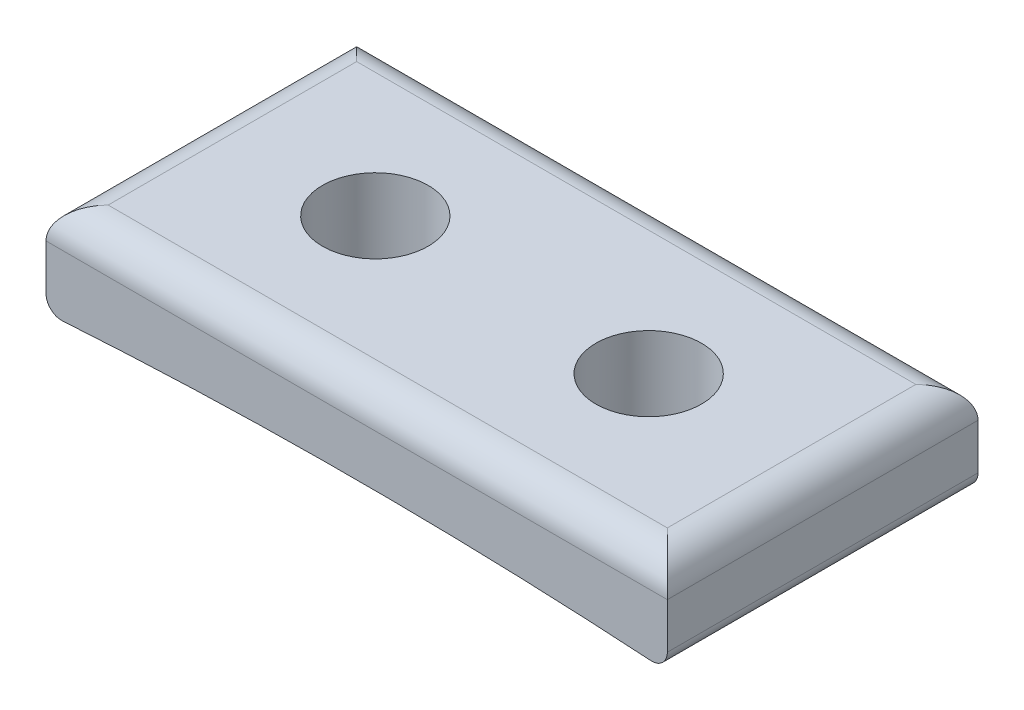
ISO-10303-21;
HEADER;
FILE_DESCRIPTION(('STEP AP214'),'2;1');
FILE_NAME('part.step','',(''),(''),'','','');
FILE_SCHEMA(('AUTOMOTIVE_DESIGN { 1 0 10303 214 1 1 1 1 }'));
ENDSEC;
DATA;
#1=APPLICATION_CONTEXT('core data for automotive mechanical design processes');
#2=APPLICATION_PROTOCOL_DEFINITION('international standard','automotive_design',2000,#1);
#3=PRODUCT_CONTEXT('',#1,'mechanical');
#4=PRODUCT('Part','Part','',(#3));
#5=PRODUCT_RELATED_PRODUCT_CATEGORY('part','',(#4));
#6=PRODUCT_DEFINITION_FORMATION('','',#4);
#7=PRODUCT_DEFINITION_CONTEXT('part definition',#1,'design');
#8=PRODUCT_DEFINITION('design','',#6,#7);
#9=PRODUCT_DEFINITION_SHAPE('','',#8);
#10=(LENGTH_UNIT() NAMED_UNIT(*) SI_UNIT(.MILLI.,.METRE.));
#11=(NAMED_UNIT(*) PLANE_ANGLE_UNIT() SI_UNIT($,.RADIAN.));
#12=(NAMED_UNIT(*) SI_UNIT($,.STERADIAN.) SOLID_ANGLE_UNIT());
#13=UNCERTAINTY_MEASURE_WITH_UNIT(LENGTH_MEASURE(1.E-05),#10,'distance_accuracy_value','');
#14=(GEOMETRIC_REPRESENTATION_CONTEXT(3) GLOBAL_UNCERTAINTY_ASSIGNED_CONTEXT((#13)) GLOBAL_UNIT_ASSIGNED_CONTEXT((#10,
#11,#12)) REPRESENTATION_CONTEXT('',''));
#15=CARTESIAN_POINT('',(0.,0.,0.));
#16=DIRECTION('',(0.,0.,1.));
#17=DIRECTION('',(1.,0.,0.));
#18=AXIS2_PLACEMENT_3D('',#15,#16,#17);
#19=CARTESIAN_POINT('',(-6.23076923076924,3.,-3.));
#20=DIRECTION('',(0.,0.,1.));
#21=DIRECTION('',(1.,0.,0.));
#22=AXIS2_PLACEMENT_3D('',#19,#20,#21);
#23=PLANE('',#22);
#24=CARTESIAN_POINT('',(3.76923076923076,-146.918654167508,-3.));
#25=DIRECTION('',(0.,0.,1.));
#26=DIRECTION('',(1.,0.,0.));
#27=AXIS2_PLACEMENT_3D('',#24,#25,#26);
#28=CIRCLE('',#27,147.258585292647);
#29=CARTESIAN_POINT('',(13.2370837370255,0.0352525603229403,-3.00000000000001));
#30=VERTEX_POINT('',#29);
#31=CARTESIAN_POINT('',(-5.69862219856403,0.0352525603229403,-3.));
#32=VERTEX_POINT('',#31);
#33=EDGE_CURVE('E171',#30,#32,#28,.T.);
#34=ORIENTED_EDGE('',*,*,#33,.T.);
#35=CARTESIAN_POINT('',(-5.73076923076924,0.534218058449193,-3.));
#36=DIRECTION('',(0.,0.,1.));
#37=DIRECTION('',(1.,0.,0.));
#38=AXIS2_PLACEMENT_3D('',#35,#36,#37);
#39=CIRCLE('',#38,0.5);
#40=CARTESIAN_POINT('',(-6.23076923076924,0.534218058449193,-3.));
#41=VERTEX_POINT('',#40);
#42=EDGE_CURVE('E53',#32,#41,#39,.F.);
#43=ORIENTED_EDGE('',*,*,#42,.T.);
#44=DIRECTION('',(0.,-1.,0.));
#45=VECTOR('',#44,1.);
#46=CARTESIAN_POINT('',(-6.23076923076924,3.,-3.));
#47=LINE('',#46,#45);
#48=CARTESIAN_POINT('',(-6.23076923076924,2.,-3.));
#49=VERTEX_POINT('',#48);
#50=EDGE_CURVE('E145',#49,#41,#47,.T.);
#51=ORIENTED_EDGE('',*,*,#50,.F.);
#52=DIRECTION('',(-1.,0.,0.));
#53=VECTOR('',#52,1.);
#54=CARTESIAN_POINT('',(-6.23076923076924,2.,-3.));
#55=LINE('',#54,#53);
#56=CARTESIAN_POINT('',(13.7692307692308,2.,-3.00000000000001));
#57=VERTEX_POINT('',#56);
#58=EDGE_CURVE('E165',#49,#57,#55,.F.);
#59=ORIENTED_EDGE('',*,*,#58,.T.);
#60=DIRECTION('',(0.,-1.,0.));
#61=VECTOR('',#60,1.);
#62=CARTESIAN_POINT('',(13.7692307692308,3.,-3.00000000000001));
#63=LINE('',#62,#61);
#64=CARTESIAN_POINT('',(13.7692307692308,0.534218058449193,-3.00000000000001));
#65=VERTEX_POINT('',#64);
#66=EDGE_CURVE('E275',#57,#65,#63,.T.);
#67=ORIENTED_EDGE('',*,*,#66,.T.);
#68=CARTESIAN_POINT('',(13.2692307692308,0.534218058449193,-3.00000000000001));
#69=DIRECTION('',(0.,0.,1.));
#70=DIRECTION('',(1.,0.,0.));
#71=AXIS2_PLACEMENT_3D('',#68,#69,#70);
#72=CIRCLE('',#71,0.5);
#73=EDGE_CURVE('E64',#65,#30,#72,.F.);
#74=ORIENTED_EDGE('',*,*,#73,.T.);
#75=EDGE_LOOP('',(#34,#43,#51,#59,#67,#74));
#76=FACE_BOUND('',#75,.T.);
#77=ADVANCED_FACE('F44',(#76),#23,.F.);
#78=CARTESIAN_POINT('',(-6.23076923076924,3.,-3.));
#79=DIRECTION('',(1.,0.,0.));
#80=DIRECTION('',(0.,0.,-1.));
#81=AXIS2_PLACEMENT_3D('',#78,#79,#80);
#82=PLANE('',#81);
#83=ORIENTED_EDGE('',*,*,#50,.T.);
#84=DIRECTION('',(0.,0.,-1.));
#85=VECTOR('',#84,1.);
#86=CARTESIAN_POINT('',(-6.23076923076924,0.534218058449193,-3.));
#87=LINE('',#86,#85);
#88=CARTESIAN_POINT('',(-6.23076923076924,0.534218058449193,7.));
#89=VERTEX_POINT('',#88);
#90=EDGE_CURVE('E170',#41,#89,#87,.F.);
#91=ORIENTED_EDGE('',*,*,#90,.T.);
#92=DIRECTION('',(0.,-1.,0.));
#93=VECTOR('',#92,1.);
#94=CARTESIAN_POINT('',(-6.23076923076924,3.,7.));
#95=LINE('',#94,#93);
#96=CARTESIAN_POINT('',(-6.23076923076924,2.,7.));
#97=VERTEX_POINT('',#96);
#98=EDGE_CURVE('E149',#97,#89,#95,.T.);
#99=ORIENTED_EDGE('',*,*,#98,.F.);
#100=DIRECTION('',(0.,0.,1.));
#101=VECTOR('',#100,1.);
#102=CARTESIAN_POINT('',(-6.23076923076924,2.,-3.));
#103=LINE('',#102,#101);
#104=EDGE_CURVE('E154',#97,#49,#103,.F.);
#105=ORIENTED_EDGE('',*,*,#104,.T.);
#106=EDGE_LOOP('',(#83,#91,#99,#105));
#107=FACE_BOUND('',#106,.T.);
#108=ADVANCED_FACE('F219',(#107),#82,.F.);
#109=CARTESIAN_POINT('',(-6.23076923076924,3.,7.));
#110=DIRECTION('',(0.,0.,-1.));
#111=DIRECTION('',(-1.,0.,0.));
#112=AXIS2_PLACEMENT_3D('',#109,#110,#111);
#113=PLANE('',#112);
#114=ORIENTED_EDGE('',*,*,#98,.T.);
#115=CARTESIAN_POINT('',(-5.73076923076924,0.534218058449193,7.));
#116=DIRECTION('',(0.,0.,-1.));
#117=DIRECTION('',(-1.,0.,0.));
#118=AXIS2_PLACEMENT_3D('',#115,#116,#117);
#119=CIRCLE('',#118,0.5);
#120=CARTESIAN_POINT('',(-5.69862219856403,0.0352525603229403,7.));
#121=VERTEX_POINT('',#120);
#122=EDGE_CURVE('E259',#89,#121,#119,.F.);
#123=ORIENTED_EDGE('',*,*,#122,.T.);
#124=CARTESIAN_POINT('',(3.76923076923076,-146.918654167508,7.));
#125=DIRECTION('',(0.,0.,-1.));
#126=DIRECTION('',(-1.,0.,0.));
#127=AXIS2_PLACEMENT_3D('',#124,#125,#126);
#128=CIRCLE('',#127,147.258585292647);
#129=CARTESIAN_POINT('',(13.2370837370255,0.0352525603229403,7.));
#130=VERTEX_POINT('',#129);
#131=EDGE_CURVE('E201',#121,#130,#128,.T.);
#132=ORIENTED_EDGE('',*,*,#131,.T.);
#133=CARTESIAN_POINT('',(13.2692307692308,0.534218058449193,6.99999999999999));
#134=DIRECTION('',(0.,0.,-1.));
#135=DIRECTION('',(-1.,0.,0.));
#136=AXIS2_PLACEMENT_3D('',#133,#134,#135);
#137=CIRCLE('',#136,0.5);
#138=CARTESIAN_POINT('',(13.7692307692308,0.534218058449193,6.99999999999999));
#139=VERTEX_POINT('',#138);
#140=EDGE_CURVE('E260',#130,#139,#137,.F.);
#141=ORIENTED_EDGE('',*,*,#140,.T.);
#142=DIRECTION('',(0.,-1.,0.));
#143=VECTOR('',#142,1.);
#144=CARTESIAN_POINT('',(13.7692307692308,3.,6.99999999999999));
#145=LINE('',#144,#143);
#146=CARTESIAN_POINT('',(13.7692307692308,2.,6.99999999999999));
#147=VERTEX_POINT('',#146);
#148=EDGE_CURVE('E268',#147,#139,#145,.T.);
#149=ORIENTED_EDGE('',*,*,#148,.F.);
#150=DIRECTION('',(1.,0.,0.));
#151=VECTOR('',#150,1.);
#152=CARTESIAN_POINT('',(-6.23076923076924,2.,7.));
#153=LINE('',#152,#151);
#154=EDGE_CURVE('E156',#147,#97,#153,.F.);
#155=ORIENTED_EDGE('',*,*,#154,.T.);
#156=EDGE_LOOP('',(#114,#123,#132,#141,#149,#155));
#157=FACE_BOUND('',#156,.T.);
#158=ADVANCED_FACE('F216',(#157),#113,.F.);
#159=CARTESIAN_POINT('',(13.7692307692308,3.,-3.00000000000001));
#160=DIRECTION('',(-1.,0.,0.));
#161=DIRECTION('',(0.,0.,1.));
#162=AXIS2_PLACEMENT_3D('',#159,#160,#161);
#163=PLANE('',#162);
#164=ORIENTED_EDGE('',*,*,#148,.T.);
#165=DIRECTION('',(0.,0.,-1.));
#166=VECTOR('',#165,1.);
#167=CARTESIAN_POINT('',(13.7692307692308,0.534218058449193,-3.00000000000001));
#168=LINE('',#167,#166);
#169=EDGE_CURVE('E11',#139,#65,#168,.T.);
#170=ORIENTED_EDGE('',*,*,#169,.T.);
#171=ORIENTED_EDGE('',*,*,#66,.F.);
#172=DIRECTION('',(0.,0.,-1.));
#173=VECTOR('',#172,1.);
#174=CARTESIAN_POINT('',(13.7692307692308,2.,-3.00000000000001));
#175=LINE('',#174,#173);
#176=EDGE_CURVE('E131',#57,#147,#175,.F.);
#177=ORIENTED_EDGE('',*,*,#176,.T.);
#178=EDGE_LOOP('',(#164,#170,#171,#177));
#179=FACE_BOUND('',#178,.T.);
#180=ADVANCED_FACE('F215',(#179),#163,.F.);
#181=CARTESIAN_POINT('',(0.,3.,0.));
#182=DIRECTION('',(0.,-1.,0.));
#183=DIRECTION('',(0.,0.,-1.));
#184=AXIS2_PLACEMENT_3D('',#181,#182,#183);
#185=PLANE('',#184);
#186=DIRECTION('',(-1.,0.,0.));
#187=VECTOR('',#186,1.);
#188=CARTESIAN_POINT('',(0.,3.,-2.00000000000001));
#189=LINE('',#188,#187);
#190=CARTESIAN_POINT('',(12.7692307692308,3.,-2.00000000000001));
#191=VERTEX_POINT('',#190);
#192=CARTESIAN_POINT('',(-5.23076923076924,3.,-2.));
#193=VERTEX_POINT('',#192);
#194=EDGE_CURVE('E117',#191,#193,#189,.T.);
#195=ORIENTED_EDGE('',*,*,#194,.T.);
#196=DIRECTION('',(0.,0.,1.));
#197=VECTOR('',#196,1.);
#198=CARTESIAN_POINT('',(-5.23076923076924,3.,0.));
#199=LINE('',#198,#197);
#200=CARTESIAN_POINT('',(-5.23076923076924,3.,6.));
#201=VERTEX_POINT('',#200);
#202=EDGE_CURVE('E155',#193,#201,#199,.T.);
#203=ORIENTED_EDGE('',*,*,#202,.T.);
#204=DIRECTION('',(1.,0.,0.));
#205=VECTOR('',#204,1.);
#206=CARTESIAN_POINT('',(0.,3.,5.99999999999999));
#207=LINE('',#206,#205);
#208=CARTESIAN_POINT('',(12.7692307692308,3.,5.99999999999999));
#209=VERTEX_POINT('',#208);
#210=EDGE_CURVE('E122',#201,#209,#207,.T.);
#211=ORIENTED_EDGE('',*,*,#210,.T.);
#212=DIRECTION('',(0.,0.,-1.));
#213=VECTOR('',#212,1.);
#214=CARTESIAN_POINT('',(12.7692307692308,3.,0.));
#215=LINE('',#214,#213);
#216=EDGE_CURVE('E115',#209,#191,#215,.T.);
#217=ORIENTED_EDGE('',*,*,#216,.T.);
#218=EDGE_LOOP('',(#195,#203,#211,#217));
#219=FACE_BOUND('',#218,.T.);
#220=CARTESIAN_POINT('',(-0.63076923076924,3.,1.99999999999999));
#221=DIRECTION('',(0.,1.,0.));
#222=DIRECTION('',(0.,0.,1.));
#223=AXIS2_PLACEMENT_3D('',#220,#221,#222);
#224=CIRCLE('',#223,1.69999999999999);
#225=CARTESIAN_POINT('',(-0.63076923076924,3.,3.69999999999998));
#226=VERTEX_POINT('',#225);
#227=EDGE_CURVE('E134',#226,#226,#224,.T.);
#228=ORIENTED_EDGE('',*,*,#227,.F.);
#229=EDGE_LOOP('',(#228));
#230=FACE_BOUND('',#229,.T.);
#231=CARTESIAN_POINT('',(8.16923076923076,3.,1.99999999999999));
#232=DIRECTION('',(0.,1.,0.));
#233=DIRECTION('',(0.,0.,1.));
#234=AXIS2_PLACEMENT_3D('',#231,#232,#233);
#235=CIRCLE('',#234,1.69999999999999);
#236=CARTESIAN_POINT('',(8.16923076923076,3.,3.69999999999998));
#237=VERTEX_POINT('',#236);
#238=EDGE_CURVE('E280',#237,#237,#235,.T.);
#239=ORIENTED_EDGE('',*,*,#238,.F.);
#240=EDGE_LOOP('',(#239));
#241=FACE_BOUND('',#240,.T.);
#242=ADVANCED_FACE('F112',(#219,#230,#241),#185,.F.);
#243=CARTESIAN_POINT('',(8.16923076923076,3.,1.99999999999999));
#244=DIRECTION('',(0.,1.,0.));
#245=DIRECTION('',(0.,0.,1.));
#246=AXIS2_PLACEMENT_3D('',#243,#244,#245);
#247=CYLINDRICAL_SURFACE('',#246,1.69999999999999);
#248=CARTESIAN_POINT('',(8.16923076923076,0.274181739650936,3.69999999999998));
#249=CARTESIAN_POINT('',(8.07373342275241,0.27703628615109,3.69999577464231));
#250=CARTESIAN_POINT('',(7.97816424864417,0.279799227505176,3.69192624368052));
#251=CARTESIAN_POINT('',(7.78965186029988,0.28506887811546,3.65984400953154));
#252=CARTESIAN_POINT('',(7.69671193172644,0.287575276200714,3.63581220349612));
#253=CARTESIAN_POINT('',(7.51621604596925,0.292280179281561,3.57248550858461));
#254=CARTESIAN_POINT('',(7.4286576322464,0.294478825353301,3.53319764459533));
#255=CARTESIAN_POINT('',(7.26140081244901,0.29854149354699,3.4404814302709));
#256=CARTESIAN_POINT('',(7.1817004597484,0.300405598636916,3.38705659413707));
#257=CARTESIAN_POINT('',(7.032411112078,0.303790386298318,3.2675878678781));
#258=CARTESIAN_POINT('',(6.9628203454499,0.305311129068408,3.20154619350325));
#259=CARTESIAN_POINT('',(6.83571069994479,0.308013578787564,3.05870890059825));
#260=CARTESIAN_POINT('',(6.77819227706166,0.309195272930779,2.98191287603977));
#261=CARTESIAN_POINT('',(6.67688066503747,0.311231014630613,2.81977250246144));
#262=CARTESIAN_POINT('',(6.63308361013031,0.3120851544854,2.73443057006596));
#263=CARTESIAN_POINT('',(6.56043777283536,0.313480346459076,2.55760326012181));
#264=CARTESIAN_POINT('',(6.53158894932298,0.314021399439309,2.46611789947532));
#265=CARTESIAN_POINT('',(6.48966195772835,0.314802087704849,2.27961236475348));
#266=CARTESIAN_POINT('',(6.4765819073654,0.315041758965517,2.18459261396594));
#267=CARTESIAN_POINT('',(6.46655788978521,0.315225748421943,1.99370565574369));
#268=CARTESIAN_POINT('',(6.4696138889794,0.315170067232502,1.89783845007345));
#269=CARTESIAN_POINT('',(6.49177465794024,0.314761935668175,1.70798137562862));
#270=CARTESIAN_POINT('',(6.51087885933941,0.314409495803374,1.6139914404888));
#271=CARTESIAN_POINT('',(6.56459243754532,0.313399445429676,1.43055333639781));
#272=CARTESIAN_POINT('',(6.59920182854928,0.312741834641352,1.34110517160536));
#273=CARTESIAN_POINT('',(6.68294289223774,0.311108343767109,1.16928833337597));
#274=CARTESIAN_POINT('',(6.73207477233428,0.310132459135542,1.08691976107236));
#275=CARTESIAN_POINT('',(6.84346436061799,0.307848619529429,0.931601048742934));
#276=CARTESIAN_POINT('',(6.90572206445742,0.306540664664877,0.858650905597402));
#277=CARTESIAN_POINT('',(7.04159977627858,0.303583115444564,0.724232848538325));
#278=CARTESIAN_POINT('',(7.11522070815326,0.301933493305644,0.662765869168186));
#279=CARTESIAN_POINT('',(7.27172936341157,0.298293099519706,0.553064057978713));
#280=CARTESIAN_POINT('',(7.3546170948164,0.296302327577394,0.50482923761305));
#281=CARTESIAN_POINT('',(7.52732288221246,0.291994701455,0.42294926297326));
#282=CARTESIAN_POINT('',(7.61714234757812,0.289677780882376,0.389307084959768));
#283=CARTESIAN_POINT('',(7.80114644183501,0.28475293684973,0.337577867885761));
#284=CARTESIAN_POINT('',(7.89533107877582,0.282145012853071,0.319490857510874));
#285=CARTESIAN_POINT('',(8.08542680542843,0.276693709081036,0.299377956501325));
#286=CARTESIAN_POINT('',(8.1813384920869,0.273850246620982,0.297357730385903));
#287=CARTESIAN_POINT('',(8.37213501745393,0.268007340016861,0.309447631475429));
#288=CARTESIAN_POINT('',(8.46701985345406,0.265007895461495,0.323557801215716));
#289=CARTESIAN_POINT('',(8.65310757736251,0.258950664981213,0.367515116779979));
#290=CARTESIAN_POINT('',(8.74430905830476,0.255892857407451,0.397368216002841));
#291=CARTESIAN_POINT('',(8.92040469145292,0.249834712492414,0.471968104833879));
#292=CARTESIAN_POINT('',(9.00529883518928,0.246834375228315,0.516714914441035));
#293=CARTESIAN_POINT('',(9.16637984799386,0.241015002654723,0.619840498978553));
#294=CARTESIAN_POINT('',(9.24256570373429,0.238195988461293,0.678220857957477));
#295=CARTESIAN_POINT('',(9.38405375939432,0.232865457966684,0.806956422290032));
#296=CARTESIAN_POINT('',(9.44935597164659,0.230353941317068,0.877311614074327));
#297=CARTESIAN_POINT('',(9.56719600213654,0.225757985687361,1.02797322115071));
#298=CARTESIAN_POINT('',(9.61973861590554,0.22367338630219,1.10827588062589));
#299=CARTESIAN_POINT('',(9.71059390026065,0.220032869197207,1.27657457435678));
#300=CARTESIAN_POINT('',(9.74890664670117,0.218476948659198,1.36457056759897));
#301=CARTESIAN_POINT('',(9.8101859232198,0.215973808432175,1.54568828690866));
#302=CARTESIAN_POINT('',(9.83316381288698,0.215026138190053,1.63880616336984));
#303=CARTESIAN_POINT('',(9.86316288825666,0.213786723692223,1.82758204024062));
#304=CARTESIAN_POINT('',(9.87018411051617,0.213494977933781,1.92324003483025));
#305=CARTESIAN_POINT('',(9.86806997370008,0.213582624948227,2.11431857447706));
#306=CARTESIAN_POINT('',(9.85894443503729,0.213961609784761,2.20973922854079));
#307=CARTESIAN_POINT('',(9.8248162530141,0.215370159282805,2.3976927427557));
#308=CARTESIAN_POINT('',(9.79981358914563,0.216399724784655,2.49022559917664));
#309=CARTESIAN_POINT('',(9.73464352582354,0.219056326738245,2.66977969173739));
#310=CARTESIAN_POINT('',(9.69447587541094,0.220683373077432,2.75680083663838));
#311=CARTESIAN_POINT('',(9.60012090396246,0.224452643894509,2.92286116431804));
#312=CARTESIAN_POINT('',(9.54593408968375,0.226594849750495,3.00190063547038));
#313=CARTESIAN_POINT('',(9.4250500917262,0.231290788183709,3.14980207101821));
#314=CARTESIAN_POINT('',(9.35834668473746,0.233844725386375,3.21865894199173));
#315=CARTESIAN_POINT('',(9.21431915037643,0.239244488004968,3.34421662281572));
#316=CARTESIAN_POINT('',(9.13699234795025,0.242090386893271,3.40091436166334));
#317=CARTESIAN_POINT('',(8.9738358665983,0.247951064740747,3.50058807482972));
#318=CARTESIAN_POINT('',(8.88799594385383,0.250966045213452,3.54354724854072));
#319=CARTESIAN_POINT('',(8.71039023919465,0.25703590310451,3.61439352457748));
#320=CARTESIAN_POINT('',(8.61863167815323,0.260090728410766,3.64229861791825));
#321=CARTESIAN_POINT('',(8.46678123073396,0.264997795216993,3.67482781148476));
#322=CARTESIAN_POINT('',(8.40767595861614,0.266872648897772,3.68425543250681));
#323=CARTESIAN_POINT('',(8.28880010221523,0.270570887872058,3.69684285085795));
#324=CARTESIAN_POINT('',(8.22902951768348,0.272394273146325,3.70000264584419));
#325=CARTESIAN_POINT('',(8.16923076923076,0.274181739650936,3.69999999999998));
#326=B_SPLINE_CURVE_WITH_KNOTS('',3,(#248,#249,#250,#251,#252,#253,#254,#255,#256,#257,#258,
#259,#260,#261,#262,#263,#264,#265,#266,#267,#268,#269,#270,#271,#272,#273,#274,#275,#276,#277,
#278,#279,#280,#281,#282,#283,#284,#285,#286,#287,#288,#289,#290,#291,#292,#293,#294,#295,#296,
#297,#298,#299,#300,#301,#302,#303,#304,#305,#306,#307,#308,#309,#310,#311,#312,#313,#314,#315,
#316,#317,#318,#319,#320,#321,#322,#323,#324,#325),.UNSPECIFIED.,.T.,.F.,(4,2,2,2,2,2,2,2,2,2,2,
2,2,2,2,2,2,2,2,2,2,2,2,2,2,2,2,2,2,2,2,2,2,2,2,2,2,2,4),(0.,0.286401762498087,
0.573146895268914,0.859760148098667,1.14630222076291,1.43279401751851,1.71929663363222,
2.00571845968506,2.29213949774903,2.57852634303297,2.8649125921781,3.15128869901753,
3.43766506807561,3.72404552739534,4.01042589185587,4.29682955289279,4.58323346183808,
4.86969575721598,5.15615858086418,5.442722395616,5.7292869660292,6.01595998245278,
6.30263338381678,6.58934010964418,6.87604651059069,7.16264498926757,7.44924194016722,
7.73562635253199,8.0220101087845,8.30821974713883,8.59442975518345,8.88064449980468,
9.16684889993514,9.45319598114553,9.73961529939849,10.026383546356,10.3128083152862,
10.4921479637885,10.6714876793262),.UNSPECIFIED.);
#327=CARTESIAN_POINT('',(8.16923076923076,0.274181739650936,3.69999999999998));
#328=VERTEX_POINT('',#327);
#329=EDGE_CURVE('E184',#328,#328,#326,.T.);
#330=ORIENTED_EDGE('',*,*,#329,.T.);
#331=EDGE_LOOP('',(#330));
#332=FACE_BOUND('',#331,.T.);
#333=ORIENTED_EDGE('',*,*,#238,.T.);
#334=EDGE_LOOP('',(#333));
#335=FACE_BOUND('',#334,.T.);
#336=ADVANCED_FACE('F207',(#332,#335),#247,.F.);
#337=CARTESIAN_POINT('',(-0.63076923076924,3.,1.99999999999999));
#338=DIRECTION('',(0.,1.,0.));
#339=DIRECTION('',(0.,0.,1.));
#340=AXIS2_PLACEMENT_3D('',#337,#338,#339);
#341=CYLINDRICAL_SURFACE('',#340,1.69999999999999);
#342=CARTESIAN_POINT('',(-0.63076923076924,0.274181739650936,3.69999999999998));
#343=CARTESIAN_POINT('',(-0.726307933056368,0.271325691150025,3.69999576635271));
#344=CARTESIAN_POINT('',(-0.821913131469769,0.268373820951858,3.69191921529223));
#345=CARTESIAN_POINT('',(-1.01048511768114,0.262371063929337,3.65981453607176));
#346=CARTESIAN_POINT('',(-1.10344858145293,0.259320061886508,3.63576716511263));
#347=CARTESIAN_POINT('',(-1.28397875825765,0.253232312332949,3.57240587262837));
#348=CARTESIAN_POINT('',(-1.3715480359313,0.250195558692344,3.53309927196804));
#349=CARTESIAN_POINT('',(-1.5388194077907,0.244257461507082,3.44034367978617));
#350=CARTESIAN_POINT('',(-1.61852345540019,0.241356084434886,3.38689821202024));
#351=CARTESIAN_POINT('',(-1.76783464799765,0.235813792820532,3.26737032931864));
#352=CARTESIAN_POINT('',(-1.83744108231942,0.233172896615101,3.20128702569495));
#353=CARTESIAN_POINT('',(-1.96457234595982,0.228274112506101,3.05835607519123));
#354=CARTESIAN_POINT('',(-2.0220967295137,0.226016238734655,2.98150803132266));
#355=CARTESIAN_POINT('',(-2.12339414128412,0.221994505634154,2.81927471622982));
#356=CARTESIAN_POINT('',(-2.16717464466283,0.22023037781832,2.73389411920932));
#357=CARTESIAN_POINT('',(-2.23977816136221,0.217283257575377,2.55698488422185));
#358=CARTESIAN_POINT('',(-2.26860127406161,0.216100261287161,2.4654562871075));
#359=CARTESIAN_POINT('',(-2.31045107862567,0.214376977752115,2.27892371480814));
#360=CARTESIAN_POINT('',(-2.32348975814928,0.213836202769287,2.18392243355421));
#361=CARTESIAN_POINT('',(-2.33343835153494,0.21342390515828,1.99307795420077));
#362=CARTESIAN_POINT('',(-2.33034834755635,0.213552379120954,1.89723476039244));
#363=CARTESIAN_POINT('',(-2.30813306267118,0.214471647651828,1.70747253399845));
#364=CARTESIAN_POINT('',(-2.28901501719233,0.215262143367961,1.61355265277961));
#365=CARTESIAN_POINT('',(-2.2352983890913,0.217464065081792,1.43025716742176));
#366=CARTESIAN_POINT('',(-2.20069978119377,0.218875492093293,1.34088157070253));
#367=CARTESIAN_POINT('',(-2.11699839065513,0.222247673548227,1.16918963049443));
#368=CARTESIAN_POINT('',(-2.06789250486986,0.224208545514724,1.08687480218794));
#369=CARTESIAN_POINT('',(-1.95657581426349,0.228582209949452,0.931656398660433));
#370=CARTESIAN_POINT('',(-1.89436496490815,0.230995003953434,0.858752855422888));
#371=CARTESIAN_POINT('',(-1.75855580371683,0.236159304073897,0.72437092393799));
#372=CARTESIAN_POINT('',(-1.68494945226265,0.238911049040707,0.662900669895053));
#373=CARTESIAN_POINT('',(-1.5284698915272,0.244627358177227,0.553188228524583));
#374=CARTESIAN_POINT('',(-1.44559664400976,0.247591923225037,0.504946095780493));
#375=CARTESIAN_POINT('',(-1.27287410569144,0.253610829919242,0.423027160891015));
#376=CARTESIAN_POINT('',(-1.18302017955047,0.256665230367577,0.389360136174343));
#377=CARTESIAN_POINT('',(-0.998933657632717,0.262744201500706,0.337593036131777));
#378=CARTESIAN_POINT('',(-0.904701054987006,0.265768772138696,0.319492985227021));
#379=CARTESIAN_POINT('',(-0.714509307094405,0.271685423413865,0.299372469685592));
#380=CARTESIAN_POINT('',(-0.618549787389589,0.274577474822017,0.29735553559996));
#381=CARTESIAN_POINT('',(-0.427649175383614,0.280144268501314,0.309470596135748));
#382=CARTESIAN_POINT('',(-0.332708082141624,0.282819010973225,0.323602575837364));
#383=CARTESIAN_POINT('',(-0.146563429930234,0.287888384384242,0.367612387286782));
#384=CARTESIAN_POINT('',(-0.0553590207560076,0.290283079274891,0.397486615528285));
#385=CARTESIAN_POINT('',(0.120742678528613,0.294752976481407,0.472133584945264));
#386=CARTESIAN_POINT('',(0.205639982282282,0.296828179488396,0.516906293891801));
#387=CARTESIAN_POINT('',(0.366680820115017,0.300638355594134,0.620060314496479));
#388=CARTESIAN_POINT('',(0.442827796710883,0.302373462682889,0.678436246874717));
#389=CARTESIAN_POINT('',(0.584241438176774,0.305500774274196,0.807150340048752));
#390=CARTESIAN_POINT('',(0.649508116977786,0.306892979215795,0.877488485528061));
#391=CARTESIAN_POINT('',(0.767286395944224,0.30934164694452,1.02810647275183));
#392=CARTESIAN_POINT('',(0.819801953494622,0.310398213930314,1.10838321828518));
#393=CARTESIAN_POINT('',(0.91061124537766,0.312189437014638,1.27661670067291));
#394=CARTESIAN_POINT('',(0.948905007771951,0.312924093748344,1.36457342237315));
#395=CARTESIAN_POINT('',(1.01017719011896,0.314085096702754,1.54565478120024));
#396=CARTESIAN_POINT('',(1.03315807257737,0.314511492496672,1.63877858478417));
#397=CARTESIAN_POINT('',(1.06316129906922,0.315066015730312,1.8275634984587));
#398=CARTESIAN_POINT('',(1.07018362068387,0.315194142751022,1.92322461211355));
#399=CARTESIAN_POINT('',(1.06807014808219,0.315155382330434,2.11436249725688));
#400=CARTESIAN_POINT('',(1.05893529853937,0.314988512136961,2.20983927919608));
#401=CARTESIAN_POINT('',(1.02476884968432,0.314355579556885,2.39790399047579));
#402=CARTESIAN_POINT('',(0.999737220971864,0.313889516616942,2.49049191447317));
#403=CARTESIAN_POINT('',(0.934487969526171,0.312647644759293,2.67015216547845));
#404=CARTESIAN_POINT('',(0.894270069357091,0.311871830182765,2.7572243916869));
#405=CARTESIAN_POINT('',(0.799792885751582,0.3099965890375,2.92337677037953));
#406=CARTESIAN_POINT('',(0.745534153572723,0.308897175173373,3.00245723645902));
#407=CARTESIAN_POINT('',(0.624520234289795,0.306362016046871,3.15038253346228));
#408=CARTESIAN_POINT('',(0.557765657861212,0.304926287219442,3.21922786428518));
#409=CARTESIAN_POINT('',(0.413633502640396,0.301711590428135,3.34475138210248));
#410=CARTESIAN_POINT('',(0.336253286147811,0.299932537193089,3.40142653899841));
#411=CARTESIAN_POINT('',(0.173041515140706,0.296036093125758,3.50101201577247));
#412=CARTESIAN_POINT('',(0.0872046161610118,0.293918487801645,3.54391355710632));
#413=CARTESIAN_POINT('',(-0.0903778744087104,0.289369457809778,3.61464894058102));
#414=CARTESIAN_POINT('',(-0.182116254080827,0.286938412664109,3.64250079699831));
#415=CARTESIAN_POINT('',(-0.333826511680592,0.282770052746419,3.67493145372311));
#416=CARTESIAN_POINT('',(-0.392815670033551,0.281114285478848,3.68432062461631));
#417=CARTESIAN_POINT('',(-0.511450982299253,0.2777120522684,3.69685621996704));
#418=CARTESIAN_POINT('',(-0.57109713622774,0.275965586323348,3.70000264427497));
#419=CARTESIAN_POINT('',(-0.63076923076924,0.274181739650936,3.69999999999998));
#420=B_SPLINE_CURVE_WITH_KNOTS('',3,(#342,#343,#344,#345,#346,#347,#348,#349,#350,#351,#352,
#353,#354,#355,#356,#357,#358,#359,#360,#361,#362,#363,#364,#365,#366,#367,#368,#369,#370,#371,
#372,#373,#374,#375,#376,#377,#378,#379,#380,#381,#382,#383,#384,#385,#386,#387,#388,#389,#390,
#391,#392,#393,#394,#395,#396,#397,#398,#399,#400,#401,#402,#403,#404,#405,#406,#407,#408,#409,
#410,#411,#412,#413,#414,#415,#416,#417,#418,#419),.UNSPECIFIED.,.T.,.F.,(4,2,2,2,2,2,2,2,2,2,2,
2,2,2,2,2,2,2,2,2,2,2,2,2,2,2,2,2,2,2,2,2,2,2,2,2,2,2,4),(0.,0.286526220170961,
0.573398295687735,0.860132909391221,1.14679612894511,1.43347951396933,1.72017347426002,
2.00671123326346,2.29324708845102,2.57956519408102,2.86588184121091,3.15206930795187,
3.43825724195722,3.72450643667771,4.01075660416655,4.29720965157164,4.58366388095546,
4.87030997595893,5.1569565206459,5.44366598798748,5.73037519044156,6.017018791727,
6.30366177293856,6.59019159538023,6.8767210509502,7.16316146643718,7.44960131673293,
7.73599509273641,8.02238927106917,8.30876670513111,8.59514466883383,8.88152786458809,
9.16789981834767,9.45425778067988,9.74068695722357,10.0272983272135,10.3135658628525,
10.492526000259,10.671486141954),.UNSPECIFIED.);
#421=CARTESIAN_POINT('',(-0.63076923076924,0.274181739650936,3.69999999999998));
#422=VERTEX_POINT('',#421);
#423=EDGE_CURVE('E176',#422,#422,#420,.T.);
#424=ORIENTED_EDGE('',*,*,#423,.T.);
#425=EDGE_LOOP('',(#424));
#426=FACE_BOUND('',#425,.T.);
#427=ORIENTED_EDGE('',*,*,#227,.T.);
#428=EDGE_LOOP('',(#427));
#429=FACE_BOUND('',#428,.T.);
#430=ADVANCED_FACE('F190',(#426,#429),#341,.F.);
#431=CARTESIAN_POINT('',(12.7692307692308,2.,0.));
#432=DIRECTION('',(0.,0.,-1.));
#433=DIRECTION('',(-1.,0.,0.));
#434=AXIS2_PLACEMENT_3D('',#431,#432,#433);
#435=CYLINDRICAL_SURFACE('',#434,1.);
#436=CARTESIAN_POINT('',(12.7692307692308,2.,5.99999999999999));
#437=DIRECTION('',(0.707106781186547,0.,-0.707106781186548));
#438=DIRECTION('',(-0.707106781186548,0.,-0.707106781186547));
#439=AXIS2_PLACEMENT_3D('',#436,#437,#438);
#440=ELLIPSE('',#439,1.41421356237309,1.);
#441=EDGE_CURVE('E137',#147,#209,#440,.F.);
#442=ORIENTED_EDGE('',*,*,#441,.F.);
#443=ORIENTED_EDGE('',*,*,#176,.F.);
#444=CARTESIAN_POINT('',(12.7692307692308,2.,-2.00000000000001));
#445=DIRECTION('',(-0.707106781186548,0.,-0.707106781186547));
#446=DIRECTION('',(-0.707106781186547,0.,0.707106781186548));
#447=AXIS2_PLACEMENT_3D('',#444,#445,#446);
#448=ELLIPSE('',#447,1.4142135623731,1.);
#449=EDGE_CURVE('E128',#191,#57,#448,.T.);
#450=ORIENTED_EDGE('',*,*,#449,.F.);
#451=ORIENTED_EDGE('',*,*,#216,.F.);
#452=EDGE_LOOP('',(#442,#443,#450,#451));
#453=FACE_BOUND('',#452,.T.);
#454=ADVANCED_FACE('F127',(#453),#435,.T.);
#455=CARTESIAN_POINT('',(0.,2.,-2.00000000000001));
#456=DIRECTION('',(-1.,0.,0.));
#457=DIRECTION('',(0.,0.,1.));
#458=AXIS2_PLACEMENT_3D('',#455,#456,#457);
#459=CYLINDRICAL_SURFACE('',#458,1.);
#460=ORIENTED_EDGE('',*,*,#449,.T.);
#461=ORIENTED_EDGE('',*,*,#58,.F.);
#462=CARTESIAN_POINT('',(-5.23076923076924,2.,-2.));
#463=DIRECTION('',(-0.707106781186547,0.,0.707106781186548));
#464=DIRECTION('',(-0.707106781186548,0.,-0.707106781186547));
#465=AXIS2_PLACEMENT_3D('',#462,#463,#464);
#466=ELLIPSE('',#465,1.41421356237309,1.);
#467=EDGE_CURVE('E136',#193,#49,#466,.T.);
#468=ORIENTED_EDGE('',*,*,#467,.F.);
#469=ORIENTED_EDGE('',*,*,#194,.F.);
#470=EDGE_LOOP('',(#460,#461,#468,#469));
#471=FACE_BOUND('',#470,.T.);
#472=ADVANCED_FACE('F140',(#471),#459,.T.);
#473=CARTESIAN_POINT('',(0.,2.,5.99999999999999));
#474=DIRECTION('',(1.,0.,0.));
#475=DIRECTION('',(0.,0.,-1.));
#476=AXIS2_PLACEMENT_3D('',#473,#474,#475);
#477=CYLINDRICAL_SURFACE('',#476,1.);
#478=ORIENTED_EDGE('',*,*,#441,.T.);
#479=ORIENTED_EDGE('',*,*,#210,.F.);
#480=CARTESIAN_POINT('',(-5.23076923076924,2.,6.));
#481=DIRECTION('',(0.707106781186548,0.,0.707106781186547));
#482=DIRECTION('',(0.707106781186547,0.,-0.707106781186548));
#483=AXIS2_PLACEMENT_3D('',#480,#481,#482);
#484=ELLIPSE('',#483,1.4142135623731,1.);
#485=EDGE_CURVE('E166',#97,#201,#484,.F.);
#486=ORIENTED_EDGE('',*,*,#485,.F.);
#487=ORIENTED_EDGE('',*,*,#154,.F.);
#488=EDGE_LOOP('',(#478,#479,#486,#487));
#489=FACE_BOUND('',#488,.T.);
#490=ADVANCED_FACE('F229',(#489),#477,.T.);
#491=CARTESIAN_POINT('',(-5.23076923076924,2.,0.));
#492=DIRECTION('',(0.,0.,1.));
#493=DIRECTION('',(1.,0.,0.));
#494=AXIS2_PLACEMENT_3D('',#491,#492,#493);
#495=CYLINDRICAL_SURFACE('',#494,1.);
#496=ORIENTED_EDGE('',*,*,#467,.T.);
#497=ORIENTED_EDGE('',*,*,#104,.F.);
#498=ORIENTED_EDGE('',*,*,#485,.T.);
#499=ORIENTED_EDGE('',*,*,#202,.F.);
#500=EDGE_LOOP('',(#496,#497,#498,#499));
#501=FACE_BOUND('',#500,.T.);
#502=ADVANCED_FACE('F193',(#501),#495,.T.);
#503=CARTESIAN_POINT('',(3.76923076923076,-146.918654167508,47.7012854316962));
#504=DIRECTION('',(0.,0.,-1.));
#505=DIRECTION('',(-1.,0.,0.));
#506=AXIS2_PLACEMENT_3D('',#503,#504,#505);
#507=CYLINDRICAL_SURFACE('',#506,147.258585292647);
#508=ORIENTED_EDGE('',*,*,#423,.F.);
#509=EDGE_LOOP('',(#508));
#510=FACE_BOUND('',#509,.T.);
#511=ORIENTED_EDGE('',*,*,#329,.F.);
#512=EDGE_LOOP('',(#511));
#513=FACE_BOUND('',#512,.T.);
#514=ORIENTED_EDGE('',*,*,#131,.F.);
#515=DIRECTION('',(0.,0.,-1.));
#516=VECTOR('',#515,1.);
#517=CARTESIAN_POINT('',(-5.69862219856403,0.0352525603229403,47.7012854316962));
#518=LINE('',#517,#516);
#519=EDGE_CURVE('E67',#121,#32,#518,.T.);
#520=ORIENTED_EDGE('',*,*,#519,.T.);
#521=ORIENTED_EDGE('',*,*,#33,.F.);
#522=DIRECTION('',(0.,0.,-1.));
#523=VECTOR('',#522,1.);
#524=CARTESIAN_POINT('',(13.2370837370255,0.0352525603229403,47.7012854316962));
#525=LINE('',#524,#523);
#526=EDGE_CURVE('E254',#30,#130,#525,.F.);
#527=ORIENTED_EDGE('',*,*,#526,.T.);
#528=EDGE_LOOP('',(#514,#520,#521,#527));
#529=FACE_BOUND('',#528,.T.);
#530=ADVANCED_FACE('F188',(#510,#513,#529),#507,.F.);
#531=CARTESIAN_POINT('',(-5.73076923076924,0.534218058449193,47.7012854316962));
#532=DIRECTION('',(0.,0.,-1.));
#533=DIRECTION('',(-1.,0.,0.));
#534=AXIS2_PLACEMENT_3D('',#531,#532,#533);
#535=CYLINDRICAL_SURFACE('',#534,0.5);
#536=ORIENTED_EDGE('',*,*,#42,.F.);
#537=ORIENTED_EDGE('',*,*,#519,.F.);
#538=ORIENTED_EDGE('',*,*,#122,.F.);
#539=ORIENTED_EDGE('',*,*,#90,.F.);
#540=EDGE_LOOP('',(#536,#537,#538,#539));
#541=FACE_BOUND('',#540,.T.);
#542=ADVANCED_FACE('F195',(#541),#535,.T.);
#543=CARTESIAN_POINT('',(13.2692307692308,0.534218058449193,47.7012854316962));
#544=DIRECTION('',(0.,0.,-1.));
#545=DIRECTION('',(-1.,0.,0.));
#546=AXIS2_PLACEMENT_3D('',#543,#544,#545);
#547=CYLINDRICAL_SURFACE('',#546,0.5);
#548=ORIENTED_EDGE('',*,*,#140,.F.);
#549=ORIENTED_EDGE('',*,*,#526,.F.);
#550=ORIENTED_EDGE('',*,*,#73,.F.);
#551=ORIENTED_EDGE('',*,*,#169,.F.);
#552=EDGE_LOOP('',(#548,#549,#550,#551));
#553=FACE_BOUND('',#552,.T.);
#554=ADVANCED_FACE('F50',(#553),#547,.T.);
#555=CLOSED_SHELL('',(#77,#108,#158,#180,#242,#336,#430,#454,#472,#490,#502,#530,#542,#554));
#556=MANIFOLD_SOLID_BREP('B2',#555);
#557=ADVANCED_BREP_SHAPE_REPRESENTATION('',(#18,#556),#14);
#558=SHAPE_DEFINITION_REPRESENTATION(#9,#557);
ENDSEC;
END-ISO-10303-21;
